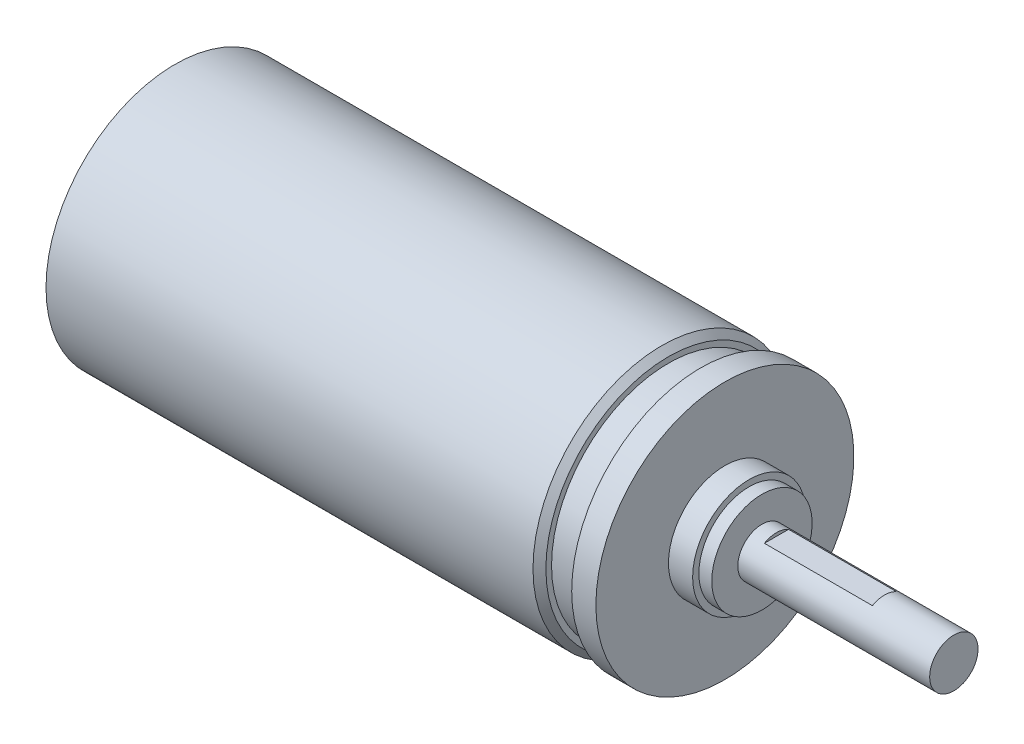
ISO-10303-21;
HEADER;
FILE_DESCRIPTION(('STEP AP214'),'2;1');
FILE_NAME('part.step','',(''),(''),'','','');
FILE_SCHEMA(('AUTOMOTIVE_DESIGN { 1 0 10303 214 1 1 1 1 }'));
ENDSEC;
DATA;
#1=APPLICATION_CONTEXT('core data for automotive mechanical design processes');
#2=APPLICATION_PROTOCOL_DEFINITION('international standard','automotive_design',2000,#1);
#3=PRODUCT_CONTEXT('',#1,'mechanical');
#4=PRODUCT('Part','Part','',(#3));
#5=PRODUCT_RELATED_PRODUCT_CATEGORY('part','',(#4));
#6=PRODUCT_DEFINITION_FORMATION('','',#4);
#7=PRODUCT_DEFINITION_CONTEXT('part definition',#1,'design');
#8=PRODUCT_DEFINITION('design','',#6,#7);
#9=PRODUCT_DEFINITION_SHAPE('','',#8);
#10=(LENGTH_UNIT() NAMED_UNIT(*) SI_UNIT(.MILLI.,.METRE.));
#11=(NAMED_UNIT(*) PLANE_ANGLE_UNIT() SI_UNIT($,.RADIAN.));
#12=(NAMED_UNIT(*) SI_UNIT($,.STERADIAN.) SOLID_ANGLE_UNIT());
#13=UNCERTAINTY_MEASURE_WITH_UNIT(LENGTH_MEASURE(1.E-05),#10,'distance_accuracy_value','');
#14=(GEOMETRIC_REPRESENTATION_CONTEXT(3) GLOBAL_UNCERTAINTY_ASSIGNED_CONTEXT((#13)) GLOBAL_UNIT_ASSIGNED_CONTEXT((#10,
#11,#12)) REPRESENTATION_CONTEXT('',''));
#15=CARTESIAN_POINT('',(0.,0.,0.));
#16=DIRECTION('',(0.,0.,1.));
#17=DIRECTION('',(1.,0.,0.));
#18=AXIS2_PLACEMENT_3D('',#15,#16,#17);
#19=CARTESIAN_POINT('',(-22.2722136857119,0.,0.));
#20=DIRECTION('',(1.,0.,0.));
#21=DIRECTION('',(0.,0.,-1.));
#22=AXIS2_PLACEMENT_3D('',#19,#20,#21);
#23=PLANE('',#22);
#24=CARTESIAN_POINT('',(-22.2722136857119,0.,0.));
#25=DIRECTION('',(-1.,0.,0.));
#26=DIRECTION('',(0.,0.,1.));
#27=AXIS2_PLACEMENT_3D('',#24,#25,#26);
#28=CIRCLE('',#27,7.99999999999999);
#29=CARTESIAN_POINT('',(-22.2722136857119,0.,7.99999999999999));
#30=VERTEX_POINT('',#29);
#31=EDGE_CURVE('E80',#30,#30,#28,.T.);
#32=ORIENTED_EDGE('',*,*,#31,.T.);
#33=EDGE_LOOP('',(#32));
#34=FACE_BOUND('',#33,.T.);
#35=ADVANCED_FACE('F34',(#34),#23,.F.);
#36=CARTESIAN_POINT('',(-64.6599979456243,0.,0.));
#37=DIRECTION('',(-1.,0.,0.));
#38=DIRECTION('',(0.,0.,1.));
#39=AXIS2_PLACEMENT_3D('',#36,#37,#38);
#40=CYLINDRICAL_SURFACE('',#39,7.99999999999999);
#41=CARTESIAN_POINT('',(7.92778631428814,0.,0.));
#42=DIRECTION('',(-1.,0.,0.));
#43=DIRECTION('',(0.,0.,1.));
#44=AXIS2_PLACEMENT_3D('',#41,#42,#43);
#45=CIRCLE('',#44,7.99999999999999);
#46=CARTESIAN_POINT('',(7.92778631428814,0.,7.99999999999999));
#47=VERTEX_POINT('',#46);
#48=EDGE_CURVE('E77',#47,#47,#45,.T.);
#49=ORIENTED_EDGE('',*,*,#48,.T.);
#50=EDGE_LOOP('',(#49));
#51=FACE_BOUND('',#50,.T.);
#52=ORIENTED_EDGE('',*,*,#31,.F.);
#53=EDGE_LOOP('',(#52));
#54=FACE_BOUND('',#53,.T.);
#55=ADVANCED_FACE('F125',(#51,#54),#40,.T.);
#56=CARTESIAN_POINT('',(8.32778631428814,7.99999999999999,0.));
#57=DIRECTION('',(-1.,0.,0.));
#58=DIRECTION('',(0.,0.,1.));
#59=AXIS2_PLACEMENT_3D('',#56,#57,#58);
#60=PLANE('',#59);
#61=CARTESIAN_POINT('',(8.32778631428814,0.,0.));
#62=DIRECTION('',(-1.,0.,0.));
#63=DIRECTION('',(0.,0.,1.));
#64=AXIS2_PLACEMENT_3D('',#61,#62,#63);
#65=CIRCLE('',#64,7.59999999999998);
#66=CARTESIAN_POINT('',(8.32778631428814,0.,7.59999999999998));
#67=VERTEX_POINT('',#66);
#68=EDGE_CURVE('E66',#67,#67,#65,.F.);
#69=ORIENTED_EDGE('',*,*,#68,.T.);
#70=EDGE_LOOP('',(#69));
#71=FACE_BOUND('',#70,.T.);
#72=CARTESIAN_POINT('',(8.32778631428814,0.,0.));
#73=DIRECTION('',(-1.,0.,0.));
#74=DIRECTION('',(0.,0.,1.));
#75=AXIS2_PLACEMENT_3D('',#72,#73,#74);
#76=CIRCLE('',#75,7.25);
#77=CARTESIAN_POINT('',(8.32778631428814,0.,7.25));
#78=VERTEX_POINT('',#77);
#79=EDGE_CURVE('E83',#78,#78,#76,.T.);
#80=ORIENTED_EDGE('',*,*,#79,.T.);
#81=EDGE_LOOP('',(#80));
#82=FACE_BOUND('',#81,.T.);
#83=ADVANCED_FACE('F130',(#71,#82),#60,.F.);
#84=CARTESIAN_POINT('',(-64.6599979456243,0.,0.));
#85=DIRECTION('',(-1.,0.,0.));
#86=DIRECTION('',(0.,0.,1.));
#87=AXIS2_PLACEMENT_3D('',#84,#85,#86);
#88=CYLINDRICAL_SURFACE('',#87,7.25);
#89=ORIENTED_EDGE('',*,*,#79,.F.);
#90=EDGE_LOOP('',(#89));
#91=FACE_BOUND('',#90,.T.);
#92=CARTESIAN_POINT('',(10.3277863142881,0.,0.));
#93=DIRECTION('',(-1.,0.,0.));
#94=DIRECTION('',(0.,0.,1.));
#95=AXIS2_PLACEMENT_3D('',#92,#93,#94);
#96=CIRCLE('',#95,7.25);
#97=CARTESIAN_POINT('',(10.3277863142881,0.,7.25));
#98=VERTEX_POINT('',#97);
#99=EDGE_CURVE('E86',#98,#98,#96,.T.);
#100=ORIENTED_EDGE('',*,*,#99,.T.);
#101=EDGE_LOOP('',(#100));
#102=FACE_BOUND('',#101,.T.);
#103=ADVANCED_FACE('F136',(#91,#102),#88,.T.);
#104=CARTESIAN_POINT('',(10.3277863142881,7.25,0.));
#105=DIRECTION('',(1.,0.,0.));
#106=DIRECTION('',(0.,0.,-1.));
#107=AXIS2_PLACEMENT_3D('',#104,#105,#106);
#108=PLANE('',#107);
#109=ORIENTED_EDGE('',*,*,#99,.F.);
#110=EDGE_LOOP('',(#109));
#111=FACE_BOUND('',#110,.T.);
#112=CARTESIAN_POINT('',(10.3277863142881,0.,0.));
#113=DIRECTION('',(-1.,0.,0.));
#114=DIRECTION('',(0.,0.,1.));
#115=AXIS2_PLACEMENT_3D('',#112,#113,#114);
#116=CIRCLE('',#115,8.);
#117=CARTESIAN_POINT('',(10.3277863142881,0.,8.));
#118=VERTEX_POINT('',#117);
#119=EDGE_CURVE('E89',#118,#118,#116,.T.);
#120=ORIENTED_EDGE('',*,*,#119,.T.);
#121=EDGE_LOOP('',(#120));
#122=FACE_BOUND('',#121,.T.);
#123=ADVANCED_FACE('F140',(#111,#122),#108,.F.);
#124=CARTESIAN_POINT('',(-64.6599979456243,0.,0.));
#125=DIRECTION('',(-1.,0.,0.));
#126=DIRECTION('',(0.,0.,1.));
#127=AXIS2_PLACEMENT_3D('',#124,#125,#126);
#128=CYLINDRICAL_SURFACE('',#127,8.);
#129=ORIENTED_EDGE('',*,*,#119,.F.);
#130=EDGE_LOOP('',(#129));
#131=FACE_BOUND('',#130,.T.);
#132=CARTESIAN_POINT('',(11.8277863142881,0.,0.));
#133=DIRECTION('',(-1.,0.,0.));
#134=DIRECTION('',(0.,0.,1.));
#135=AXIS2_PLACEMENT_3D('',#132,#133,#134);
#136=CIRCLE('',#135,8.);
#137=CARTESIAN_POINT('',(11.8277863142881,0.,8.));
#138=VERTEX_POINT('',#137);
#139=EDGE_CURVE('E92',#138,#138,#136,.T.);
#140=ORIENTED_EDGE('',*,*,#139,.T.);
#141=EDGE_LOOP('',(#140));
#142=FACE_BOUND('',#141,.T.);
#143=ADVANCED_FACE('F144',(#131,#142),#128,.T.);
#144=CARTESIAN_POINT('',(11.8277863142881,8.,0.));
#145=DIRECTION('',(-1.,0.,0.));
#146=DIRECTION('',(0.,0.,1.));
#147=AXIS2_PLACEMENT_3D('',#144,#145,#146);
#148=PLANE('',#147);
#149=ORIENTED_EDGE('',*,*,#139,.F.);
#150=EDGE_LOOP('',(#149));
#151=FACE_BOUND('',#150,.T.);
#152=CARTESIAN_POINT('',(11.8277863142881,0.,0.));
#153=DIRECTION('',(-1.,0.,0.));
#154=DIRECTION('',(0.,0.,1.));
#155=AXIS2_PLACEMENT_3D('',#152,#153,#154);
#156=CIRCLE('',#155,3.5);
#157=CARTESIAN_POINT('',(11.8277863142881,0.,3.5));
#158=VERTEX_POINT('',#157);
#159=EDGE_CURVE('E95',#158,#158,#156,.T.);
#160=ORIENTED_EDGE('',*,*,#159,.T.);
#161=EDGE_LOOP('',(#160));
#162=FACE_BOUND('',#161,.T.);
#163=ADVANCED_FACE('F148',(#151,#162),#148,.F.);
#164=CARTESIAN_POINT('',(-64.6599979456243,0.,0.));
#165=DIRECTION('',(-1.,0.,0.));
#166=DIRECTION('',(0.,0.,1.));
#167=AXIS2_PLACEMENT_3D('',#164,#165,#166);
#168=CYLINDRICAL_SURFACE('',#167,3.5);
#169=ORIENTED_EDGE('',*,*,#159,.F.);
#170=EDGE_LOOP('',(#169));
#171=FACE_BOUND('',#170,.T.);
#172=CARTESIAN_POINT('',(13.3277863142881,0.,0.));
#173=DIRECTION('',(-1.,0.,0.));
#174=DIRECTION('',(0.,0.,1.));
#175=AXIS2_PLACEMENT_3D('',#172,#173,#174);
#176=CIRCLE('',#175,3.5);
#177=CARTESIAN_POINT('',(13.3277863142881,0.,3.5));
#178=VERTEX_POINT('',#177);
#179=EDGE_CURVE('E98',#178,#178,#176,.T.);
#180=ORIENTED_EDGE('',*,*,#179,.T.);
#181=EDGE_LOOP('',(#180));
#182=FACE_BOUND('',#181,.T.);
#183=ADVANCED_FACE('F152',(#171,#182),#168,.T.);
#184=CARTESIAN_POINT('',(13.3277863142881,3.5,0.));
#185=DIRECTION('',(-1.,0.,0.));
#186=DIRECTION('',(0.,0.,1.));
#187=AXIS2_PLACEMENT_3D('',#184,#185,#186);
#188=PLANE('',#187);
#189=ORIENTED_EDGE('',*,*,#179,.F.);
#190=EDGE_LOOP('',(#189));
#191=FACE_BOUND('',#190,.T.);
#192=CARTESIAN_POINT('',(13.3277863142881,0.,0.));
#193=DIRECTION('',(-1.,0.,0.));
#194=DIRECTION('',(0.,0.,1.));
#195=AXIS2_PLACEMENT_3D('',#192,#193,#194);
#196=CIRCLE('',#195,3.11166585873925);
#197=CARTESIAN_POINT('',(13.3277863142881,0.,3.11166585873925));
#198=VERTEX_POINT('',#197);
#199=EDGE_CURVE('E101',#198,#198,#196,.T.);
#200=ORIENTED_EDGE('',*,*,#199,.T.);
#201=EDGE_LOOP('',(#200));
#202=FACE_BOUND('',#201,.T.);
#203=ADVANCED_FACE('F156',(#191,#202),#188,.F.);
#204=CARTESIAN_POINT('',(-64.6599979456243,0.,0.));
#205=DIRECTION('',(-1.,0.,0.));
#206=DIRECTION('',(0.,0.,1.));
#207=AXIS2_PLACEMENT_3D('',#204,#205,#206);
#208=CYLINDRICAL_SURFACE('',#207,3.11166585873925);
#209=ORIENTED_EDGE('',*,*,#199,.F.);
#210=EDGE_LOOP('',(#209));
#211=FACE_BOUND('',#210,.T.);
#212=CARTESIAN_POINT('',(14.1277863142881,0.,0.));
#213=DIRECTION('',(-1.,0.,0.));
#214=DIRECTION('',(0.,0.,1.));
#215=AXIS2_PLACEMENT_3D('',#212,#213,#214);
#216=CIRCLE('',#215,3.11166585873925);
#217=CARTESIAN_POINT('',(14.1277863142881,0.,3.11166585873925));
#218=VERTEX_POINT('',#217);
#219=EDGE_CURVE('E104',#218,#218,#216,.T.);
#220=ORIENTED_EDGE('',*,*,#219,.T.);
#221=EDGE_LOOP('',(#220));
#222=FACE_BOUND('',#221,.T.);
#223=ADVANCED_FACE('F160',(#211,#222),#208,.T.);
#224=CARTESIAN_POINT('',(14.1277863142881,3.11166585873925,0.));
#225=DIRECTION('',(-1.,0.,0.));
#226=DIRECTION('',(0.,0.,1.));
#227=AXIS2_PLACEMENT_3D('',#224,#225,#226);
#228=PLANE('',#227);
#229=ORIENTED_EDGE('',*,*,#219,.F.);
#230=EDGE_LOOP('',(#229));
#231=FACE_BOUND('',#230,.T.);
#232=CARTESIAN_POINT('',(14.1277863142881,0.,0.));
#233=DIRECTION('',(-1.,0.,0.));
#234=DIRECTION('',(0.,0.,1.));
#235=AXIS2_PLACEMENT_3D('',#232,#233,#234);
#236=CIRCLE('',#235,1.5);
#237=CARTESIAN_POINT('',(14.1277863142881,0.,1.5));
#238=VERTEX_POINT('',#237);
#239=EDGE_CURVE('E107',#238,#238,#236,.T.);
#240=ORIENTED_EDGE('',*,*,#239,.T.);
#241=EDGE_LOOP('',(#240));
#242=FACE_BOUND('',#241,.T.);
#243=ADVANCED_FACE('F164',(#231,#242),#228,.F.);
#244=CARTESIAN_POINT('',(-64.6599979456243,0.,0.));
#245=DIRECTION('',(-1.,0.,0.));
#246=DIRECTION('',(0.,0.,1.));
#247=AXIS2_PLACEMENT_3D('',#244,#245,#246);
#248=CYLINDRICAL_SURFACE('',#247,1.5);
#249=DIRECTION('',(-1.,0.,0.));
#250=VECTOR('',#249,1.);
#251=CARTESIAN_POINT('',(-64.6599979456243,1.29999999999999,-0.748331477354802));
#252=LINE('',#251,#250);
#253=CARTESIAN_POINT('',(15.0277863142882,1.3,-0.748331477354788));
#254=VERTEX_POINT('',#253);
#255=CARTESIAN_POINT('',(21.7277863142881,1.3,-0.748331477354802));
#256=VERTEX_POINT('',#255);
#257=EDGE_CURVE('E65',#254,#256,#252,.F.);
#258=ORIENTED_EDGE('',*,*,#257,.T.);
#259=CARTESIAN_POINT('',(21.7277863142881,0.,0.));
#260=DIRECTION('',(1.,0.,0.));
#261=DIRECTION('',(0.,0.,-1.));
#262=AXIS2_PLACEMENT_3D('',#259,#260,#261);
#263=CIRCLE('',#262,1.5);
#264=CARTESIAN_POINT('',(21.7277863142881,1.3,0.748331477354801));
#265=VERTEX_POINT('',#264);
#266=EDGE_CURVE('E11',#256,#265,#263,.T.);
#267=ORIENTED_EDGE('',*,*,#266,.T.);
#268=DIRECTION('',(-1.,0.,0.));
#269=VECTOR('',#268,1.);
#270=CARTESIAN_POINT('',(-64.6599979456243,1.29999999999999,0.748331477354802));
#271=LINE('',#270,#269);
#272=CARTESIAN_POINT('',(15.0277863142882,1.3,0.748331477354788));
#273=VERTEX_POINT('',#272);
#274=EDGE_CURVE('E42',#265,#273,#271,.T.);
#275=ORIENTED_EDGE('',*,*,#274,.T.);
#276=CARTESIAN_POINT('',(15.0277863142882,0.,0.));
#277=DIRECTION('',(-1.,0.,0.));
#278=DIRECTION('',(0.,0.,1.));
#279=AXIS2_PLACEMENT_3D('',#276,#277,#278);
#280=CIRCLE('',#279,1.5);
#281=EDGE_CURVE('E61',#273,#254,#280,.T.);
#282=ORIENTED_EDGE('',*,*,#281,.T.);
#283=EDGE_LOOP('',(#258,#267,#275,#282));
#284=FACE_BOUND('',#283,.T.);
#285=ORIENTED_EDGE('',*,*,#239,.F.);
#286=EDGE_LOOP('',(#285));
#287=FACE_BOUND('',#286,.T.);
#288=CARTESIAN_POINT('',(26.0277863142882,0.,0.));
#289=DIRECTION('',(-1.,0.,0.));
#290=DIRECTION('',(0.,0.,1.));
#291=AXIS2_PLACEMENT_3D('',#288,#289,#290);
#292=CIRCLE('',#291,1.5);
#293=CARTESIAN_POINT('',(26.0277863142882,0.,1.5));
#294=VERTEX_POINT('',#293);
#295=EDGE_CURVE('E110',#294,#294,#292,.T.);
#296=ORIENTED_EDGE('',*,*,#295,.T.);
#297=EDGE_LOOP('',(#296));
#298=FACE_BOUND('',#297,.T.);
#299=ADVANCED_FACE('F71',(#284,#287,#298),#248,.T.);
#300=CARTESIAN_POINT('',(26.0277863142881,1.5,0.));
#301=DIRECTION('',(-1.,0.,0.));
#302=DIRECTION('',(0.,0.,1.));
#303=AXIS2_PLACEMENT_3D('',#300,#301,#302);
#304=PLANE('',#303);
#305=ORIENTED_EDGE('',*,*,#295,.F.);
#306=EDGE_LOOP('',(#305));
#307=FACE_BOUND('',#306,.T.);
#308=ADVANCED_FACE('F122',(#307),#304,.F.);
#309=CARTESIAN_POINT('',(7.92778631428814,0.,0.));
#310=DIRECTION('',(-1.,0.,0.));
#311=DIRECTION('',(0.,0.,1.));
#312=AXIS2_PLACEMENT_3D('',#309,#310,#311);
#313=CONICAL_SURFACE('',#312,7.99999999999999,0.785398163397461);
#314=ORIENTED_EDGE('',*,*,#68,.F.);
#315=EDGE_LOOP('',(#314));
#316=FACE_BOUND('',#315,.T.);
#317=ORIENTED_EDGE('',*,*,#48,.F.);
#318=EDGE_LOOP('',(#317));
#319=FACE_BOUND('',#318,.T.);
#320=ADVANCED_FACE('F36',(#316,#319),#313,.T.);
#321=CARTESIAN_POINT('',(21.7277863142881,1.5,-8.));
#322=DIRECTION('',(1.,0.,0.));
#323=DIRECTION('',(0.,0.,-1.));
#324=AXIS2_PLACEMENT_3D('',#321,#322,#323);
#325=PLANE('',#324);
#326=DIRECTION('',(0.,0.,1.));
#327=VECTOR('',#326,1.);
#328=CARTESIAN_POINT('',(21.7277863142881,1.3,-8.));
#329=LINE('',#328,#327);
#330=EDGE_CURVE('E69',#256,#265,#329,.T.);
#331=ORIENTED_EDGE('',*,*,#330,.T.);
#332=ORIENTED_EDGE('',*,*,#266,.F.);
#333=EDGE_LOOP('',(#331,#332));
#334=FACE_BOUND('',#333,.T.);
#335=ADVANCED_FACE('F114',(#334),#325,.F.);
#336=CARTESIAN_POINT('',(21.7277863142881,1.3,-8.));
#337=DIRECTION('',(0.,-1.,0.));
#338=DIRECTION('',(1.,0.,0.));
#339=AXIS2_PLACEMENT_3D('',#336,#337,#338);
#340=PLANE('',#339);
#341=ORIENTED_EDGE('',*,*,#330,.F.);
#342=ORIENTED_EDGE('',*,*,#257,.F.);
#343=DIRECTION('',(0.,0.,1.));
#344=VECTOR('',#343,1.);
#345=CARTESIAN_POINT('',(15.0277863142881,1.3,-8.));
#346=LINE('',#345,#344);
#347=EDGE_CURVE('E48',#254,#273,#346,.T.);
#348=ORIENTED_EDGE('',*,*,#347,.T.);
#349=ORIENTED_EDGE('',*,*,#274,.F.);
#350=EDGE_LOOP('',(#341,#342,#348,#349));
#351=FACE_BOUND('',#350,.T.);
#352=ADVANCED_FACE('F68',(#351),#340,.F.);
#353=CARTESIAN_POINT('',(15.0277863142881,1.3,-8.));
#354=DIRECTION('',(-1.,0.,0.));
#355=DIRECTION('',(0.,0.,1.));
#356=AXIS2_PLACEMENT_3D('',#353,#354,#355);
#357=PLANE('',#356);
#358=ORIENTED_EDGE('',*,*,#347,.F.);
#359=ORIENTED_EDGE('',*,*,#281,.F.);
#360=EDGE_LOOP('',(#358,#359));
#361=FACE_BOUND('',#360,.T.);
#362=ADVANCED_FACE('F62',(#361),#357,.F.);
#363=CLOSED_SHELL('',(#35,#55,#83,#103,#123,#143,#163,#183,#203,#223,#243,#299,#308,#320,#335,
#352,#362));
#364=MANIFOLD_SOLID_BREP('B2',#363);
#365=ADVANCED_BREP_SHAPE_REPRESENTATION('',(#18,#364),#14);
#366=SHAPE_DEFINITION_REPRESENTATION(#9,#365);
ENDSEC;
END-ISO-10303-21;
